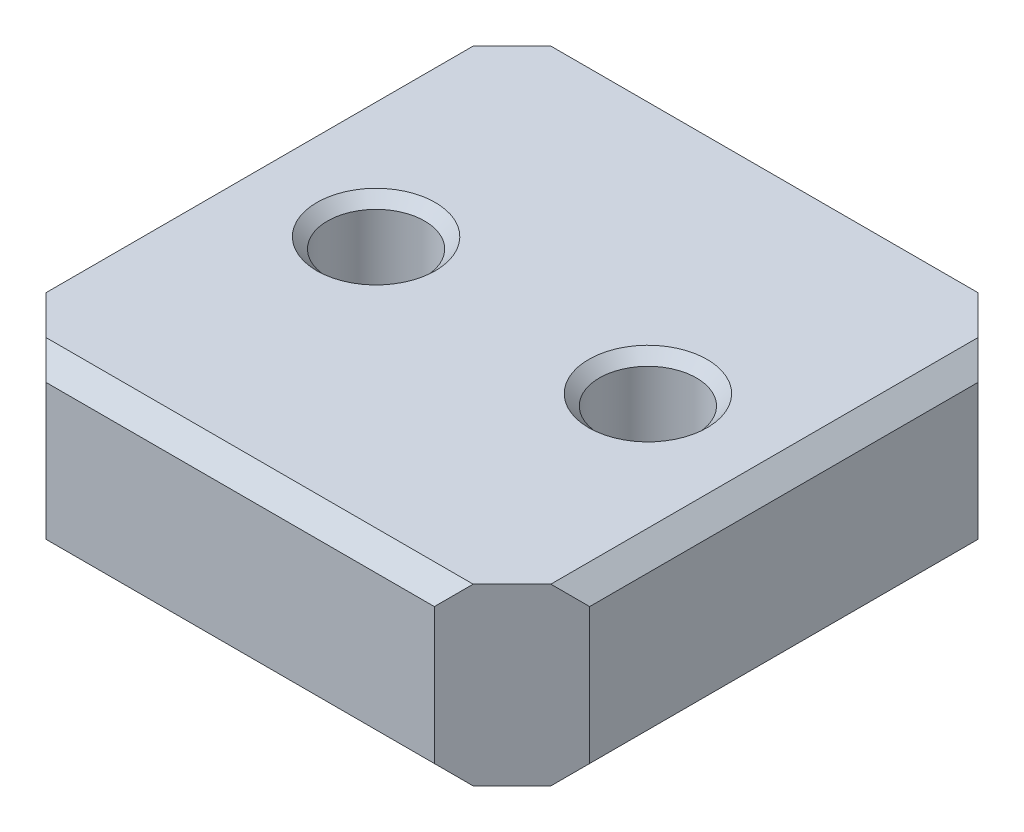
ISO-10303-21;
HEADER;
FILE_DESCRIPTION(('STEP AP214'),'2;1');
FILE_NAME('part.step','',(''),(''),'','','');
FILE_SCHEMA(('AUTOMOTIVE_DESIGN { 1 0 10303 214 1 1 1 1 }'));
ENDSEC;
DATA;
#1=APPLICATION_CONTEXT('core data for automotive mechanical design processes');
#2=APPLICATION_PROTOCOL_DEFINITION('international standard','automotive_design',2000,#1);
#3=PRODUCT_CONTEXT('',#1,'mechanical');
#4=PRODUCT('Part','Part','',(#3));
#5=PRODUCT_RELATED_PRODUCT_CATEGORY('part','',(#4));
#6=PRODUCT_DEFINITION_FORMATION('','',#4);
#7=PRODUCT_DEFINITION_CONTEXT('part definition',#1,'design');
#8=PRODUCT_DEFINITION('design','',#6,#7);
#9=PRODUCT_DEFINITION_SHAPE('','',#8);
#10=(LENGTH_UNIT() NAMED_UNIT(*) SI_UNIT(.MILLI.,.METRE.));
#11=(NAMED_UNIT(*) PLANE_ANGLE_UNIT() SI_UNIT($,.RADIAN.));
#12=(NAMED_UNIT(*) SI_UNIT($,.STERADIAN.) SOLID_ANGLE_UNIT());
#13=UNCERTAINTY_MEASURE_WITH_UNIT(LENGTH_MEASURE(1.E-05),#10,'distance_accuracy_value','');
#14=(GEOMETRIC_REPRESENTATION_CONTEXT(3) GLOBAL_UNCERTAINTY_ASSIGNED_CONTEXT((#13)) GLOBAL_UNIT_ASSIGNED_CONTEXT((#10,
#11,#12)) REPRESENTATION_CONTEXT('',''));
#15=CARTESIAN_POINT('',(0.,0.,0.));
#16=DIRECTION('',(0.,0.,1.));
#17=DIRECTION('',(1.,0.,0.));
#18=AXIS2_PLACEMENT_3D('',#15,#16,#17);
#19=CARTESIAN_POINT('',(0.,4.5,-6.5));
#20=DIRECTION('',(0.,0.707106781186546,-0.707106781186549));
#21=DIRECTION('',(-1.,0.,0.));
#22=AXIS2_PLACEMENT_3D('',#19,#20,#21);
#23=PLANE('',#22);
#24=DIRECTION('',(0.577350269189624,0.577350269189628,0.577350269189626));
#25=VECTOR('',#24,1.);
#26=CARTESIAN_POINT('',(5.16666666666667,4.16666666666667,-6.83333333333334));
#27=LINE('',#26,#25);
#28=CARTESIAN_POINT('',(5.,4.,-7.));
#29=VERTEX_POINT('',#28);
#30=CARTESIAN_POINT('',(5.5,4.5,-6.5));
#31=VERTEX_POINT('',#30);
#32=EDGE_CURVE('E25',#29,#31,#27,.T.);
#33=ORIENTED_EDGE('',*,*,#32,.F.);
#34=DIRECTION('',(1.,0.,0.));
#35=VECTOR('',#34,1.);
#36=CARTESIAN_POINT('',(5.,4.,-7.));
#37=LINE('',#36,#35);
#38=CARTESIAN_POINT('',(-5.,4.,-7.));
#39=VERTEX_POINT('',#38);
#40=EDGE_CURVE('E372',#39,#29,#37,.T.);
#41=ORIENTED_EDGE('',*,*,#40,.F.);
#42=DIRECTION('',(0.577350269189627,-0.577350269189626,-0.577350269189625));
#43=VECTOR('',#42,1.);
#44=CARTESIAN_POINT('',(-6.5,5.5,-5.5));
#45=LINE('',#44,#43);
#46=CARTESIAN_POINT('',(-5.5,4.5,-6.5));
#47=VERTEX_POINT('',#46);
#48=EDGE_CURVE('E266',#47,#39,#45,.T.);
#49=ORIENTED_EDGE('',*,*,#48,.F.);
#50=DIRECTION('',(-1.,0.,0.));
#51=VECTOR('',#50,1.);
#52=CARTESIAN_POINT('',(-5.,4.5,-6.5));
#53=LINE('',#52,#51);
#54=EDGE_CURVE('E319',#31,#47,#53,.T.);
#55=ORIENTED_EDGE('',*,*,#54,.F.);
#56=EDGE_LOOP('',(#33,#41,#49,#55));
#57=FACE_BOUND('',#56,.T.);
#58=ADVANCED_FACE('F17',(#57),#23,.T.);
#59=CARTESIAN_POINT('',(-6.5,4.5,0.));
#60=DIRECTION('',(-0.707106781186549,0.707106781186546,0.));
#61=DIRECTION('',(0.,0.,1.));
#62=AXIS2_PLACEMENT_3D('',#59,#60,#61);
#63=PLANE('',#62);
#64=DIRECTION('',(0.577350269189626,0.577350269189628,-0.577350269189624));
#65=VECTOR('',#64,1.);
#66=CARTESIAN_POINT('',(-6.83333333333333,4.16666666666667,-5.16666666666667));
#67=LINE('',#66,#65);
#68=CARTESIAN_POINT('',(-7.,4.,-5.));
#69=VERTEX_POINT('',#68);
#70=CARTESIAN_POINT('',(-6.5,4.5,-5.5));
#71=VERTEX_POINT('',#70);
#72=EDGE_CURVE('E296',#69,#71,#67,.T.);
#73=ORIENTED_EDGE('',*,*,#72,.F.);
#74=DIRECTION('',(0.,0.,-1.));
#75=VECTOR('',#74,1.);
#76=CARTESIAN_POINT('',(-7.,4.,-5.));
#77=LINE('',#76,#75);
#78=CARTESIAN_POINT('',(-7.,4.,5.));
#79=VERTEX_POINT('',#78);
#80=EDGE_CURVE('E399',#79,#69,#77,.T.);
#81=ORIENTED_EDGE('',*,*,#80,.F.);
#82=DIRECTION('',(-0.577350269189625,-0.577350269189627,-0.577350269189627));
#83=VECTOR('',#82,1.);
#84=CARTESIAN_POINT('',(-5.5,5.5,6.5));
#85=LINE('',#84,#83);
#86=CARTESIAN_POINT('',(-6.5,4.5,5.5));
#87=VERTEX_POINT('',#86);
#88=EDGE_CURVE('E285',#87,#79,#85,.T.);
#89=ORIENTED_EDGE('',*,*,#88,.F.);
#90=DIRECTION('',(0.,0.,1.));
#91=VECTOR('',#90,1.);
#92=CARTESIAN_POINT('',(-6.5,4.5,5.));
#93=LINE('',#92,#91);
#94=EDGE_CURVE('E339',#71,#87,#93,.T.);
#95=ORIENTED_EDGE('',*,*,#94,.F.);
#96=EDGE_LOOP('',(#73,#81,#89,#95));
#97=FACE_BOUND('',#96,.T.);
#98=ADVANCED_FACE('F684',(#97),#63,.T.);
#99=CARTESIAN_POINT('',(6.5,4.5,0.));
#100=DIRECTION('',(0.707106781186549,0.707106781186546,0.));
#101=DIRECTION('',(0.,0.,-1.));
#102=AXIS2_PLACEMENT_3D('',#99,#100,#101);
#103=PLANE('',#102);
#104=DIRECTION('',(-0.577350269189626,0.577350269189628,0.577350269189624));
#105=VECTOR('',#104,1.);
#106=CARTESIAN_POINT('',(6.83333333333333,4.16666666666667,5.16666666666667));
#107=LINE('',#106,#105);
#108=CARTESIAN_POINT('',(7.,4.,5.));
#109=VERTEX_POINT('',#108);
#110=CARTESIAN_POINT('',(6.5,4.5,5.5));
#111=VERTEX_POINT('',#110);
#112=EDGE_CURVE('E292',#109,#111,#107,.T.);
#113=ORIENTED_EDGE('',*,*,#112,.F.);
#114=DIRECTION('',(0.,0.,1.));
#115=VECTOR('',#114,1.);
#116=CARTESIAN_POINT('',(7.,4.,5.));
#117=LINE('',#116,#115);
#118=CARTESIAN_POINT('',(7.,4.,-5.));
#119=VERTEX_POINT('',#118);
#120=EDGE_CURVE('E358',#119,#109,#117,.T.);
#121=ORIENTED_EDGE('',*,*,#120,.F.);
#122=DIRECTION('',(0.577350269189625,-0.577350269189627,0.577350269189627));
#123=VECTOR('',#122,1.);
#124=CARTESIAN_POINT('',(5.5,5.5,-6.5));
#125=LINE('',#124,#123);
#126=CARTESIAN_POINT('',(6.5,4.5,-5.5));
#127=VERTEX_POINT('',#126);
#128=EDGE_CURVE('E11',#127,#119,#125,.T.);
#129=ORIENTED_EDGE('',*,*,#128,.F.);
#130=DIRECTION('',(0.,0.,-1.));
#131=VECTOR('',#130,1.);
#132=CARTESIAN_POINT('',(6.5,4.5,-5.));
#133=LINE('',#132,#131);
#134=EDGE_CURVE('E330',#111,#127,#133,.T.);
#135=ORIENTED_EDGE('',*,*,#134,.F.);
#136=EDGE_LOOP('',(#113,#121,#129,#135));
#137=FACE_BOUND('',#136,.T.);
#138=ADVANCED_FACE('F679',(#137),#103,.T.);
#139=CARTESIAN_POINT('',(0.,4.5,6.5));
#140=DIRECTION('',(0.,0.707106781186548,0.707106781186548));
#141=DIRECTION('',(1.,0.,0.));
#142=AXIS2_PLACEMENT_3D('',#139,#140,#141);
#143=PLANE('',#142);
#144=DIRECTION('',(-0.577350269189624,0.577350269189627,-0.577350269189626));
#145=VECTOR('',#144,1.);
#146=CARTESIAN_POINT('',(-5.16666666666667,4.16666666666667,6.83333333333333));
#147=LINE('',#146,#145);
#148=CARTESIAN_POINT('',(-5.,4.,7.));
#149=VERTEX_POINT('',#148);
#150=CARTESIAN_POINT('',(-5.5,4.5,6.5));
#151=VERTEX_POINT('',#150);
#152=EDGE_CURVE('E282',#149,#151,#147,.T.);
#153=ORIENTED_EDGE('',*,*,#152,.F.);
#154=DIRECTION('',(-1.,0.,0.));
#155=VECTOR('',#154,1.);
#156=CARTESIAN_POINT('',(-5.,4.,7.));
#157=LINE('',#156,#155);
#158=CARTESIAN_POINT('',(5.,4.,7.));
#159=VERTEX_POINT('',#158);
#160=EDGE_CURVE('E408',#159,#149,#157,.T.);
#161=ORIENTED_EDGE('',*,*,#160,.F.);
#162=DIRECTION('',(-0.577350269189627,-0.577350269189625,0.577350269189625));
#163=VECTOR('',#162,1.);
#164=CARTESIAN_POINT('',(6.5,5.5,5.5));
#165=LINE('',#164,#163);
#166=CARTESIAN_POINT('',(5.5,4.5,6.5));
#167=VERTEX_POINT('',#166);
#168=EDGE_CURVE('E297',#167,#159,#165,.T.);
#169=ORIENTED_EDGE('',*,*,#168,.F.);
#170=DIRECTION('',(1.,0.,0.));
#171=VECTOR('',#170,1.);
#172=CARTESIAN_POINT('',(5.,4.5,6.5));
#173=LINE('',#172,#171);
#174=EDGE_CURVE('E371',#151,#167,#173,.T.);
#175=ORIENTED_EDGE('',*,*,#174,.F.);
#176=EDGE_LOOP('',(#153,#161,#169,#175));
#177=FACE_BOUND('',#176,.T.);
#178=ADVANCED_FACE('F683',(#177),#143,.T.);
#179=CARTESIAN_POINT('',(7.,0.5,-7.));
#180=DIRECTION('',(0.,0.707106781186549,0.707106781186546));
#181=DIRECTION('',(1.,0.,0.));
#182=AXIS2_PLACEMENT_3D('',#179,#180,#181);
#183=PLANE('',#182);
#184=DIRECTION('',(-0.577350269189625,0.577350269189625,-0.577350269189627));
#185=VECTOR('',#184,1.);
#186=CARTESIAN_POINT('',(3.66666666666667,1.83333333333333,-8.33333333333334));
#187=LINE('',#186,#185);
#188=CARTESIAN_POINT('',(5.5,0.,-6.5));
#189=VERTEX_POINT('',#188);
#190=CARTESIAN_POINT('',(5.,0.5,-7.));
#191=VERTEX_POINT('',#190);
#192=EDGE_CURVE('E250',#189,#191,#187,.T.);
#193=ORIENTED_EDGE('',*,*,#192,.F.);
#194=DIRECTION('',(1.,0.,0.));
#195=VECTOR('',#194,1.);
#196=CARTESIAN_POINT('',(0.,0.,-6.5));
#197=LINE('',#196,#195);
#198=CARTESIAN_POINT('',(-5.5,0.,-6.5));
#199=VERTEX_POINT('',#198);
#200=EDGE_CURVE('E249',#199,#189,#197,.T.);
#201=ORIENTED_EDGE('',*,*,#200,.F.);
#202=DIRECTION('',(-0.577350269189628,-0.577350269189624,0.577350269189626));
#203=VECTOR('',#202,1.);
#204=CARTESIAN_POINT('',(-5.,0.499999999999993,-7.));
#205=LINE('',#204,#203);
#206=CARTESIAN_POINT('',(-5.,0.5,-7.));
#207=VERTEX_POINT('',#206);
#208=EDGE_CURVE('E263',#207,#199,#205,.T.);
#209=ORIENTED_EDGE('',*,*,#208,.F.);
#210=DIRECTION('',(-1.,0.,0.));
#211=VECTOR('',#210,1.);
#212=CARTESIAN_POINT('',(7.,0.5,-7.));
#213=LINE('',#212,#211);
#214=EDGE_CURVE('E357',#191,#207,#213,.T.);
#215=ORIENTED_EDGE('',*,*,#214,.F.);
#216=EDGE_LOOP('',(#193,#201,#209,#215));
#217=FACE_BOUND('',#216,.T.);
#218=ADVANCED_FACE('F745',(#217),#183,.F.);
#219=CARTESIAN_POINT('',(-7.,0.5,7.));
#220=DIRECTION('',(0.707106781186546,0.707106781186549,0.));
#221=DIRECTION('',(0.,0.,-1.));
#222=AXIS2_PLACEMENT_3D('',#219,#220,#221);
#223=PLANE('',#222);
#224=DIRECTION('',(-0.577350269189627,0.577350269189625,0.577350269189625));
#225=VECTOR('',#224,1.);
#226=CARTESIAN_POINT('',(-8.33333333333334,1.83333333333333,-3.66666666666667));
#227=LINE('',#226,#225);
#228=CARTESIAN_POINT('',(-6.5,0.,-5.5));
#229=VERTEX_POINT('',#228);
#230=CARTESIAN_POINT('',(-7.,0.5,-5.));
#231=VERTEX_POINT('',#230);
#232=EDGE_CURVE('E293',#229,#231,#227,.T.);
#233=ORIENTED_EDGE('',*,*,#232,.F.);
#234=DIRECTION('',(0.,0.,-1.));
#235=VECTOR('',#234,1.);
#236=CARTESIAN_POINT('',(-6.5,0.,0.));
#237=LINE('',#236,#235);
#238=CARTESIAN_POINT('',(-6.5,0.,5.5));
#239=VERTEX_POINT('',#238);
#240=EDGE_CURVE('E241',#239,#229,#237,.T.);
#241=ORIENTED_EDGE('',*,*,#240,.F.);
#242=DIRECTION('',(0.577350269189626,-0.577350269189624,0.577350269189628));
#243=VECTOR('',#242,1.);
#244=CARTESIAN_POINT('',(-7.,0.499999999999994,5.));
#245=LINE('',#244,#243);
#246=CARTESIAN_POINT('',(-7.,0.5,5.));
#247=VERTEX_POINT('',#246);
#248=EDGE_CURVE('E212',#247,#239,#245,.T.);
#249=ORIENTED_EDGE('',*,*,#248,.F.);
#250=DIRECTION('',(0.,0.,1.));
#251=VECTOR('',#250,1.);
#252=CARTESIAN_POINT('',(-7.,0.5,7.));
#253=LINE('',#252,#251);
#254=EDGE_CURVE('E428',#231,#247,#253,.T.);
#255=ORIENTED_EDGE('',*,*,#254,.F.);
#256=EDGE_LOOP('',(#233,#241,#249,#255));
#257=FACE_BOUND('',#256,.T.);
#258=ADVANCED_FACE('F463',(#257),#223,.F.);
#259=CARTESIAN_POINT('',(7.,0.5,7.));
#260=DIRECTION('',(-0.707106781186546,0.707106781186549,0.));
#261=DIRECTION('',(0.,0.,1.));
#262=AXIS2_PLACEMENT_3D('',#259,#260,#261);
#263=PLANE('',#262);
#264=DIRECTION('',(0.577350269189627,0.577350269189625,-0.577350269189625));
#265=VECTOR('',#264,1.);
#266=CARTESIAN_POINT('',(8.33333333333333,1.83333333333333,3.66666666666667));
#267=LINE('',#266,#265);
#268=CARTESIAN_POINT('',(6.5,0.,5.5));
#269=VERTEX_POINT('',#268);
#270=CARTESIAN_POINT('',(7.,0.5,5.));
#271=VERTEX_POINT('',#270);
#272=EDGE_CURVE('E211',#269,#271,#267,.T.);
#273=ORIENTED_EDGE('',*,*,#272,.F.);
#274=DIRECTION('',(0.,0.,1.));
#275=VECTOR('',#274,1.);
#276=CARTESIAN_POINT('',(6.5,0.,0.));
#277=LINE('',#276,#275);
#278=CARTESIAN_POINT('',(6.5,0.,-5.5));
#279=VERTEX_POINT('',#278);
#280=EDGE_CURVE('E228',#279,#269,#277,.T.);
#281=ORIENTED_EDGE('',*,*,#280,.F.);
#282=DIRECTION('',(-0.577350269189626,-0.577350269189624,-0.577350269189628));
#283=VECTOR('',#282,1.);
#284=CARTESIAN_POINT('',(7.,0.499999999999992,-5.));
#285=LINE('',#284,#283);
#286=CARTESIAN_POINT('',(7.,0.5,-5.));
#287=VERTEX_POINT('',#286);
#288=EDGE_CURVE('E253',#287,#279,#285,.T.);
#289=ORIENTED_EDGE('',*,*,#288,.F.);
#290=DIRECTION('',(0.,0.,-1.));
#291=VECTOR('',#290,1.);
#292=CARTESIAN_POINT('',(7.,0.5,7.));
#293=LINE('',#292,#291);
#294=EDGE_CURVE('E363',#271,#287,#293,.T.);
#295=ORIENTED_EDGE('',*,*,#294,.F.);
#296=EDGE_LOOP('',(#273,#281,#289,#295));
#297=FACE_BOUND('',#296,.T.);
#298=ADVANCED_FACE('F744',(#297),#263,.F.);
#299=CARTESIAN_POINT('',(7.,0.5,7.));
#300=DIRECTION('',(0.,0.70710678118655,-0.707106781186545));
#301=DIRECTION('',(-1.,0.,0.));
#302=AXIS2_PLACEMENT_3D('',#299,#300,#301);
#303=PLANE('',#302);
#304=DIRECTION('',(0.577350269189626,0.577350269189624,0.577350269189628));
#305=VECTOR('',#304,1.);
#306=CARTESIAN_POINT('',(-3.66666666666667,1.83333333333332,8.33333333333333));
#307=LINE('',#306,#305);
#308=CARTESIAN_POINT('',(-5.5,0.,6.5));
#309=VERTEX_POINT('',#308);
#310=CARTESIAN_POINT('',(-5.,0.5,7.));
#311=VERTEX_POINT('',#310);
#312=EDGE_CURVE('E217',#309,#311,#307,.T.);
#313=ORIENTED_EDGE('',*,*,#312,.F.);
#314=DIRECTION('',(-1.,0.,0.));
#315=VECTOR('',#314,1.);
#316=CARTESIAN_POINT('',(0.,0.,6.5));
#317=LINE('',#316,#315);
#318=CARTESIAN_POINT('',(5.5,0.,6.5));
#319=VERTEX_POINT('',#318);
#320=EDGE_CURVE('E215',#319,#309,#317,.T.);
#321=ORIENTED_EDGE('',*,*,#320,.F.);
#322=DIRECTION('',(0.577350269189628,-0.577350269189623,-0.577350269189627));
#323=VECTOR('',#322,1.);
#324=CARTESIAN_POINT('',(5.,0.499999999999987,7.));
#325=LINE('',#324,#323);
#326=CARTESIAN_POINT('',(5.,0.5,7.));
#327=VERTEX_POINT('',#326);
#328=EDGE_CURVE('E200',#327,#319,#325,.T.);
#329=ORIENTED_EDGE('',*,*,#328,.F.);
#330=DIRECTION('',(1.,0.,0.));
#331=VECTOR('',#330,1.);
#332=CARTESIAN_POINT('',(7.,0.5,7.));
#333=LINE('',#332,#331);
#334=EDGE_CURVE('E398',#311,#327,#333,.T.);
#335=ORIENTED_EDGE('',*,*,#334,.F.);
#336=EDGE_LOOP('',(#313,#321,#329,#335));
#337=FACE_BOUND('',#336,.T.);
#338=ADVANCED_FACE('F216',(#337),#303,.F.);
#339=CARTESIAN_POINT('',(5.,4.5,-7.));
#340=DIRECTION('',(-0.707106781186549,0.,0.707106781186546));
#341=DIRECTION('',(0.,1.,0.));
#342=AXIS2_PLACEMENT_3D('',#339,#340,#341);
#343=PLANE('',#342);
#344=DIRECTION('',(0.,1.,0.));
#345=VECTOR('',#344,1.);
#346=CARTESIAN_POINT('',(7.,4.5,-5.));
#347=LINE('',#346,#345);
#348=EDGE_CURVE('E359',#287,#119,#347,.T.);
#349=ORIENTED_EDGE('',*,*,#348,.F.);
#350=ORIENTED_EDGE('',*,*,#288,.T.);
#351=DIRECTION('',(0.707106781186546,0.,0.707106781186549));
#352=VECTOR('',#351,1.);
#353=CARTESIAN_POINT('',(5.,0.,-7.));
#354=LINE('',#353,#352);
#355=EDGE_CURVE('E257',#189,#279,#354,.T.);
#356=ORIENTED_EDGE('',*,*,#355,.F.);
#357=ORIENTED_EDGE('',*,*,#192,.T.);
#358=DIRECTION('',(0.,-1.,0.));
#359=VECTOR('',#358,1.);
#360=CARTESIAN_POINT('',(5.,4.5,-7.));
#361=LINE('',#360,#359);
#362=EDGE_CURVE('E314',#29,#191,#361,.T.);
#363=ORIENTED_EDGE('',*,*,#362,.F.);
#364=ORIENTED_EDGE('',*,*,#32,.T.);
#365=DIRECTION('',(-0.707106781186546,0.,-0.707106781186549));
#366=VECTOR('',#365,1.);
#367=CARTESIAN_POINT('',(6.,4.5,-6.));
#368=LINE('',#367,#366);
#369=EDGE_CURVE('E311',#127,#31,#368,.T.);
#370=ORIENTED_EDGE('',*,*,#369,.F.);
#371=ORIENTED_EDGE('',*,*,#128,.T.);
#372=EDGE_LOOP('',(#349,#350,#356,#357,#363,#364,#370,#371));
#373=FACE_BOUND('',#372,.T.);
#374=ADVANCED_FACE('F309',(#373),#343,.F.);
#375=CARTESIAN_POINT('',(-7.,4.5,-5.));
#376=DIRECTION('',(0.707106781186546,0.,0.707106781186549));
#377=DIRECTION('',(0.,-1.,0.));
#378=AXIS2_PLACEMENT_3D('',#375,#376,#377);
#379=PLANE('',#378);
#380=DIRECTION('',(0.707106781186549,0.,-0.707106781186546));
#381=VECTOR('',#380,1.);
#382=CARTESIAN_POINT('',(-7.,0.,-5.));
#383=LINE('',#382,#381);
#384=EDGE_CURVE('E245',#229,#199,#383,.T.);
#385=ORIENTED_EDGE('',*,*,#384,.F.);
#386=ORIENTED_EDGE('',*,*,#232,.T.);
#387=DIRECTION('',(0.,-1.,0.));
#388=VECTOR('',#387,1.);
#389=CARTESIAN_POINT('',(-7.,4.5,-5.));
#390=LINE('',#389,#388);
#391=EDGE_CURVE('E431',#69,#231,#390,.T.);
#392=ORIENTED_EDGE('',*,*,#391,.F.);
#393=ORIENTED_EDGE('',*,*,#72,.T.);
#394=DIRECTION('',(-0.707106781186549,0.,0.707106781186546));
#395=VECTOR('',#394,1.);
#396=CARTESIAN_POINT('',(-6.,4.5,-6.));
#397=LINE('',#396,#395);
#398=EDGE_CURVE('E324',#47,#71,#397,.T.);
#399=ORIENTED_EDGE('',*,*,#398,.F.);
#400=ORIENTED_EDGE('',*,*,#48,.T.);
#401=DIRECTION('',(0.,1.,0.));
#402=VECTOR('',#401,1.);
#403=CARTESIAN_POINT('',(-5.,4.5,-7.));
#404=LINE('',#403,#402);
#405=EDGE_CURVE('E367',#207,#39,#404,.T.);
#406=ORIENTED_EDGE('',*,*,#405,.F.);
#407=ORIENTED_EDGE('',*,*,#208,.T.);
#408=EDGE_LOOP('',(#385,#386,#392,#393,#399,#400,#406,#407));
#409=FACE_BOUND('',#408,.T.);
#410=ADVANCED_FACE('F415',(#409),#379,.F.);
#411=CARTESIAN_POINT('',(7.,4.5,5.));
#412=DIRECTION('',(-0.707106781186547,0.,-0.707106781186549));
#413=DIRECTION('',(-0.707106781186549,0.,0.707106781186547));
#414=AXIS2_PLACEMENT_3D('',#411,#412,#413);
#415=PLANE('',#414);
#416=DIRECTION('',(0.,1.,0.));
#417=VECTOR('',#416,1.);
#418=CARTESIAN_POINT('',(5.,4.5,7.));
#419=LINE('',#418,#417);
#420=EDGE_CURVE('E206',#327,#159,#419,.T.);
#421=ORIENTED_EDGE('',*,*,#420,.F.);
#422=ORIENTED_EDGE('',*,*,#328,.T.);
#423=DIRECTION('',(-0.707106781186549,0.,0.707106781186547));
#424=VECTOR('',#423,1.);
#425=CARTESIAN_POINT('',(7.,0.,5.));
#426=LINE('',#425,#424);
#427=EDGE_CURVE('E204',#269,#319,#426,.T.);
#428=ORIENTED_EDGE('',*,*,#427,.F.);
#429=ORIENTED_EDGE('',*,*,#272,.T.);
#430=DIRECTION('',(0.,-1.,0.));
#431=VECTOR('',#430,1.);
#432=CARTESIAN_POINT('',(7.,4.5,5.));
#433=LINE('',#432,#431);
#434=EDGE_CURVE('E353',#109,#271,#433,.T.);
#435=ORIENTED_EDGE('',*,*,#434,.F.);
#436=ORIENTED_EDGE('',*,*,#112,.T.);
#437=DIRECTION('',(0.707106781186549,0.,-0.707106781186547));
#438=VECTOR('',#437,1.);
#439=CARTESIAN_POINT('',(6.,4.5,6.));
#440=LINE('',#439,#438);
#441=EDGE_CURVE('E336',#167,#111,#440,.T.);
#442=ORIENTED_EDGE('',*,*,#441,.F.);
#443=ORIENTED_EDGE('',*,*,#168,.T.);
#444=EDGE_LOOP('',(#421,#422,#428,#429,#435,#436,#442,#443));
#445=FACE_BOUND('',#444,.T.);
#446=ADVANCED_FACE('F202',(#445),#415,.F.);
#447=CARTESIAN_POINT('',(-5.,4.5,7.));
#448=DIRECTION('',(0.707106781186549,0.,-0.707106781186546));
#449=DIRECTION('',(0.,-1.,0.));
#450=AXIS2_PLACEMENT_3D('',#447,#448,#449);
#451=PLANE('',#450);
#452=DIRECTION('',(-0.707106781186546,0.,-0.707106781186549));
#453=VECTOR('',#452,1.);
#454=CARTESIAN_POINT('',(-5.,0.,7.));
#455=LINE('',#454,#453);
#456=EDGE_CURVE('E222',#309,#239,#455,.T.);
#457=ORIENTED_EDGE('',*,*,#456,.F.);
#458=ORIENTED_EDGE('',*,*,#312,.T.);
#459=DIRECTION('',(0.,-1.,0.));
#460=VECTOR('',#459,1.);
#461=CARTESIAN_POINT('',(-5.,4.5,7.));
#462=LINE('',#461,#460);
#463=EDGE_CURVE('E394',#149,#311,#462,.T.);
#464=ORIENTED_EDGE('',*,*,#463,.F.);
#465=ORIENTED_EDGE('',*,*,#152,.T.);
#466=DIRECTION('',(0.707106781186546,0.,0.707106781186549));
#467=VECTOR('',#466,1.);
#468=CARTESIAN_POINT('',(-6.,4.5,6.));
#469=LINE('',#468,#467);
#470=EDGE_CURVE('E368',#87,#151,#469,.T.);
#471=ORIENTED_EDGE('',*,*,#470,.F.);
#472=ORIENTED_EDGE('',*,*,#88,.T.);
#473=DIRECTION('',(0.,1.,0.));
#474=VECTOR('',#473,1.);
#475=CARTESIAN_POINT('',(-7.,4.5,5.));
#476=LINE('',#475,#474);
#477=EDGE_CURVE('E387',#247,#79,#476,.T.);
#478=ORIENTED_EDGE('',*,*,#477,.F.);
#479=ORIENTED_EDGE('',*,*,#248,.T.);
#480=EDGE_LOOP('',(#457,#458,#464,#465,#471,#472,#478,#479));
#481=FACE_BOUND('',#480,.T.);
#482=ADVANCED_FACE('F466',(#481),#451,.F.);
#483=CARTESIAN_POINT('',(-3.5,4.5,0.));
#484=DIRECTION('',(0.,1.,0.));
#485=DIRECTION('',(0.,0.,1.));
#486=AXIS2_PLACEMENT_3D('',#483,#484,#485);
#487=CONICAL_SURFACE('',#486,1.525,0.785398163397448);
#488=CARTESIAN_POINT('',(-3.5,4.225,0.));
#489=DIRECTION('',(0.,1.,0.));
#490=DIRECTION('',(0.,0.,1.));
#491=AXIS2_PLACEMENT_3D('',#488,#489,#490);
#492=CIRCLE('',#491,1.25);
#493=CARTESIAN_POINT('',(-3.5,4.225,1.25));
#494=VERTEX_POINT('',#493);
#495=EDGE_CURVE('E36',#494,#494,#492,.T.);
#496=ORIENTED_EDGE('',*,*,#495,.F.);
#497=EDGE_LOOP('',(#496));
#498=FACE_BOUND('',#497,.T.);
#499=CARTESIAN_POINT('',(-3.5,4.5,0.));
#500=DIRECTION('',(0.,1.,0.));
#501=DIRECTION('',(0.,0.,1.));
#502=AXIS2_PLACEMENT_3D('',#499,#500,#501);
#503=CIRCLE('',#502,1.525);
#504=CARTESIAN_POINT('',(-3.5,4.5,1.525));
#505=VERTEX_POINT('',#504);
#506=EDGE_CURVE('E236',#505,#505,#503,.T.);
#507=ORIENTED_EDGE('',*,*,#506,.T.);
#508=EDGE_LOOP('',(#507));
#509=FACE_BOUND('',#508,.T.);
#510=ADVANCED_FACE('F712',(#498,#509),#487,.F.);
#511=CARTESIAN_POINT('',(-3.5,4.5,0.));
#512=DIRECTION('',(0.,1.,0.));
#513=DIRECTION('',(0.,0.,1.));
#514=AXIS2_PLACEMENT_3D('',#511,#512,#513);
#515=CYLINDRICAL_SURFACE('',#514,1.25);
#516=CARTESIAN_POINT('',(-3.5,0.275,0.));
#517=DIRECTION('',(0.,1.,0.));
#518=DIRECTION('',(0.,0.,1.));
#519=AXIS2_PLACEMENT_3D('',#516,#517,#518);
#520=CIRCLE('',#519,1.25);
#521=CARTESIAN_POINT('',(-3.5,0.275,1.25));
#522=VERTEX_POINT('',#521);
#523=EDGE_CURVE('E44',#522,#522,#520,.T.);
#524=ORIENTED_EDGE('',*,*,#523,.F.);
#525=EDGE_LOOP('',(#524));
#526=FACE_BOUND('',#525,.T.);
#527=ORIENTED_EDGE('',*,*,#495,.T.);
#528=EDGE_LOOP('',(#527));
#529=FACE_BOUND('',#528,.T.);
#530=ADVANCED_FACE('F735',(#526,#529),#515,.F.);
#531=CARTESIAN_POINT('',(-3.5,0.275,0.));
#532=DIRECTION('',(0.,-1.,0.));
#533=DIRECTION('',(0.,0.,-1.));
#534=AXIS2_PLACEMENT_3D('',#531,#532,#533);
#535=CONICAL_SURFACE('',#534,1.25,0.785398163397447);
#536=ORIENTED_EDGE('',*,*,#523,.T.);
#537=EDGE_LOOP('',(#536));
#538=FACE_BOUND('',#537,.T.);
#539=CARTESIAN_POINT('',(-3.5,0.,0.));
#540=DIRECTION('',(0.,1.,0.));
#541=DIRECTION('',(0.,0.,1.));
#542=AXIS2_PLACEMENT_3D('',#539,#540,#541);
#543=CIRCLE('',#542,1.525);
#544=CARTESIAN_POINT('',(-3.5,0.,1.525));
#545=VERTEX_POINT('',#544);
#546=EDGE_CURVE('E262',#545,#545,#543,.T.);
#547=ORIENTED_EDGE('',*,*,#546,.F.);
#548=EDGE_LOOP('',(#547));
#549=FACE_BOUND('',#548,.T.);
#550=ADVANCED_FACE('F760',(#538,#549),#535,.F.);
#551=CARTESIAN_POINT('',(3.5,4.5,0.));
#552=DIRECTION('',(0.,1.,0.));
#553=DIRECTION('',(0.,0.,1.));
#554=AXIS2_PLACEMENT_3D('',#551,#552,#553);
#555=CONICAL_SURFACE('',#554,1.525,0.785398163397447);
#556=CARTESIAN_POINT('',(3.5,4.225,0.));
#557=DIRECTION('',(0.,1.,0.));
#558=DIRECTION('',(0.,0.,1.));
#559=AXIS2_PLACEMENT_3D('',#556,#557,#558);
#560=CIRCLE('',#559,1.25);
#561=CARTESIAN_POINT('',(3.5,4.225,1.25));
#562=VERTEX_POINT('',#561);
#563=EDGE_CURVE('E275',#562,#562,#560,.T.);
#564=ORIENTED_EDGE('',*,*,#563,.F.);
#565=EDGE_LOOP('',(#564));
#566=FACE_BOUND('',#565,.T.);
#567=CARTESIAN_POINT('',(3.5,4.5,0.));
#568=DIRECTION('',(0.,1.,0.));
#569=DIRECTION('',(0.,0.,1.));
#570=AXIS2_PLACEMENT_3D('',#567,#568,#569);
#571=CIRCLE('',#570,1.525);
#572=CARTESIAN_POINT('',(3.5,4.5,1.525));
#573=VERTEX_POINT('',#572);
#574=EDGE_CURVE('E230',#573,#573,#571,.T.);
#575=ORIENTED_EDGE('',*,*,#574,.T.);
#576=EDGE_LOOP('',(#575));
#577=FACE_BOUND('',#576,.T.);
#578=ADVANCED_FACE('F703',(#566,#577),#555,.F.);
#579=CARTESIAN_POINT('',(3.5,4.5,0.));
#580=DIRECTION('',(0.,1.,0.));
#581=DIRECTION('',(0.,0.,1.));
#582=AXIS2_PLACEMENT_3D('',#579,#580,#581);
#583=CYLINDRICAL_SURFACE('',#582,1.25);
#584=CARTESIAN_POINT('',(3.5,0.275,0.));
#585=DIRECTION('',(0.,1.,0.));
#586=DIRECTION('',(0.,0.,1.));
#587=AXIS2_PLACEMENT_3D('',#584,#585,#586);
#588=CIRCLE('',#587,1.25);
#589=CARTESIAN_POINT('',(3.5,0.275,1.25));
#590=VERTEX_POINT('',#589);
#591=EDGE_CURVE('E272',#590,#590,#588,.T.);
#592=ORIENTED_EDGE('',*,*,#591,.F.);
#593=EDGE_LOOP('',(#592));
#594=FACE_BOUND('',#593,.T.);
#595=ORIENTED_EDGE('',*,*,#563,.T.);
#596=EDGE_LOOP('',(#595));
#597=FACE_BOUND('',#596,.T.);
#598=ADVANCED_FACE('F698',(#594,#597),#583,.F.);
#599=CARTESIAN_POINT('',(3.5,0.275,0.));
#600=DIRECTION('',(0.,-1.,0.));
#601=DIRECTION('',(0.,0.,-1.));
#602=AXIS2_PLACEMENT_3D('',#599,#600,#601);
#603=CONICAL_SURFACE('',#602,1.25,0.785398163397447);
#604=ORIENTED_EDGE('',*,*,#591,.T.);
#605=EDGE_LOOP('',(#604));
#606=FACE_BOUND('',#605,.T.);
#607=CARTESIAN_POINT('',(3.5,0.,0.));
#608=DIRECTION('',(0.,1.,0.));
#609=DIRECTION('',(0.,0.,1.));
#610=AXIS2_PLACEMENT_3D('',#607,#608,#609);
#611=CIRCLE('',#610,1.525);
#612=CARTESIAN_POINT('',(3.5,0.,1.525));
#613=VERTEX_POINT('',#612);
#614=EDGE_CURVE('E269',#613,#613,#611,.T.);
#615=ORIENTED_EDGE('',*,*,#614,.F.);
#616=EDGE_LOOP('',(#615));
#617=FACE_BOUND('',#616,.T.);
#618=ADVANCED_FACE('F702',(#606,#617),#603,.F.);
#619=CARTESIAN_POINT('',(0.,0.,0.));
#620=DIRECTION('',(0.,1.,0.));
#621=DIRECTION('',(1.,0.,0.));
#622=AXIS2_PLACEMENT_3D('',#619,#620,#621);
#623=PLANE('',#622);
#624=ORIENTED_EDGE('',*,*,#614,.T.);
#625=EDGE_LOOP('',(#624));
#626=FACE_BOUND('',#625,.T.);
#627=ORIENTED_EDGE('',*,*,#546,.T.);
#628=EDGE_LOOP('',(#627));
#629=FACE_BOUND('',#628,.T.);
#630=ORIENTED_EDGE('',*,*,#427,.T.);
#631=ORIENTED_EDGE('',*,*,#320,.T.);
#632=ORIENTED_EDGE('',*,*,#456,.T.);
#633=ORIENTED_EDGE('',*,*,#240,.T.);
#634=ORIENTED_EDGE('',*,*,#384,.T.);
#635=ORIENTED_EDGE('',*,*,#200,.T.);
#636=ORIENTED_EDGE('',*,*,#355,.T.);
#637=ORIENTED_EDGE('',*,*,#280,.T.);
#638=EDGE_LOOP('',(#630,#631,#632,#633,#634,#635,#636,#637));
#639=FACE_BOUND('',#638,.T.);
#640=ADVANCED_FACE('F225',(#626,#629,#639),#623,.F.);
#641=CARTESIAN_POINT('',(0.,4.5,0.));
#642=DIRECTION('',(0.,1.,0.));
#643=DIRECTION('',(1.,0.,0.));
#644=AXIS2_PLACEMENT_3D('',#641,#642,#643);
#645=PLANE('',#644);
#646=ORIENTED_EDGE('',*,*,#574,.F.);
#647=EDGE_LOOP('',(#646));
#648=FACE_BOUND('',#647,.T.);
#649=ORIENTED_EDGE('',*,*,#506,.F.);
#650=EDGE_LOOP('',(#649));
#651=FACE_BOUND('',#650,.T.);
#652=ORIENTED_EDGE('',*,*,#470,.T.);
#653=ORIENTED_EDGE('',*,*,#174,.T.);
#654=ORIENTED_EDGE('',*,*,#441,.T.);
#655=ORIENTED_EDGE('',*,*,#134,.T.);
#656=ORIENTED_EDGE('',*,*,#369,.T.);
#657=ORIENTED_EDGE('',*,*,#54,.T.);
#658=ORIENTED_EDGE('',*,*,#398,.T.);
#659=ORIENTED_EDGE('',*,*,#94,.T.);
#660=EDGE_LOOP('',(#652,#653,#654,#655,#656,#657,#658,#659));
#661=FACE_BOUND('',#660,.T.);
#662=ADVANCED_FACE('F327',(#648,#651,#661),#645,.T.);
#663=CARTESIAN_POINT('',(7.,4.5,-7.));
#664=DIRECTION('',(0.,0.,1.));
#665=DIRECTION('',(1.,0.,0.));
#666=AXIS2_PLACEMENT_3D('',#663,#664,#665);
#667=PLANE('',#666);
#668=ORIENTED_EDGE('',*,*,#362,.T.);
#669=ORIENTED_EDGE('',*,*,#214,.T.);
#670=ORIENTED_EDGE('',*,*,#405,.T.);
#671=ORIENTED_EDGE('',*,*,#40,.T.);
#672=EDGE_LOOP('',(#668,#669,#670,#671));
#673=FACE_BOUND('',#672,.T.);
#674=ADVANCED_FACE('F418',(#673),#667,.F.);
#675=CARTESIAN_POINT('',(7.,4.5,7.));
#676=DIRECTION('',(-1.,0.,0.));
#677=DIRECTION('',(0.,0.,1.));
#678=AXIS2_PLACEMENT_3D('',#675,#676,#677);
#679=PLANE('',#678);
#680=ORIENTED_EDGE('',*,*,#434,.T.);
#681=ORIENTED_EDGE('',*,*,#294,.T.);
#682=ORIENTED_EDGE('',*,*,#348,.T.);
#683=ORIENTED_EDGE('',*,*,#120,.T.);
#684=EDGE_LOOP('',(#680,#681,#682,#683));
#685=FACE_BOUND('',#684,.T.);
#686=ADVANCED_FACE('F720',(#685),#679,.F.);
#687=CARTESIAN_POINT('',(7.,4.5,7.));
#688=DIRECTION('',(0.,0.,-1.));
#689=DIRECTION('',(-1.,0.,0.));
#690=AXIS2_PLACEMENT_3D('',#687,#688,#689);
#691=PLANE('',#690);
#692=ORIENTED_EDGE('',*,*,#463,.T.);
#693=ORIENTED_EDGE('',*,*,#334,.T.);
#694=ORIENTED_EDGE('',*,*,#420,.T.);
#695=ORIENTED_EDGE('',*,*,#160,.T.);
#696=EDGE_LOOP('',(#692,#693,#694,#695));
#697=FACE_BOUND('',#696,.T.);
#698=ADVANCED_FACE('F693',(#697),#691,.F.);
#699=CARTESIAN_POINT('',(-7.,4.5,7.));
#700=DIRECTION('',(1.,0.,0.));
#701=DIRECTION('',(0.,1.,0.));
#702=AXIS2_PLACEMENT_3D('',#699,#700,#701);
#703=PLANE('',#702);
#704=ORIENTED_EDGE('',*,*,#391,.T.);
#705=ORIENTED_EDGE('',*,*,#254,.T.);
#706=ORIENTED_EDGE('',*,*,#477,.T.);
#707=ORIENTED_EDGE('',*,*,#80,.T.);
#708=EDGE_LOOP('',(#704,#705,#706,#707));
#709=FACE_BOUND('',#708,.T.);
#710=ADVANCED_FACE('F457',(#709),#703,.F.);
#711=CLOSED_SHELL('',(#58,#98,#138,#178,#218,#258,#298,#338,#374,#410,#446,#482,#510,#530,#550,
#578,#598,#618,#640,#662,#674,#686,#698,#710));
#712=MANIFOLD_SOLID_BREP('B1',#711);
#713=ADVANCED_BREP_SHAPE_REPRESENTATION('',(#18,#712),#14);
#714=SHAPE_DEFINITION_REPRESENTATION(#9,#713);
ENDSEC;
END-ISO-10303-21;
